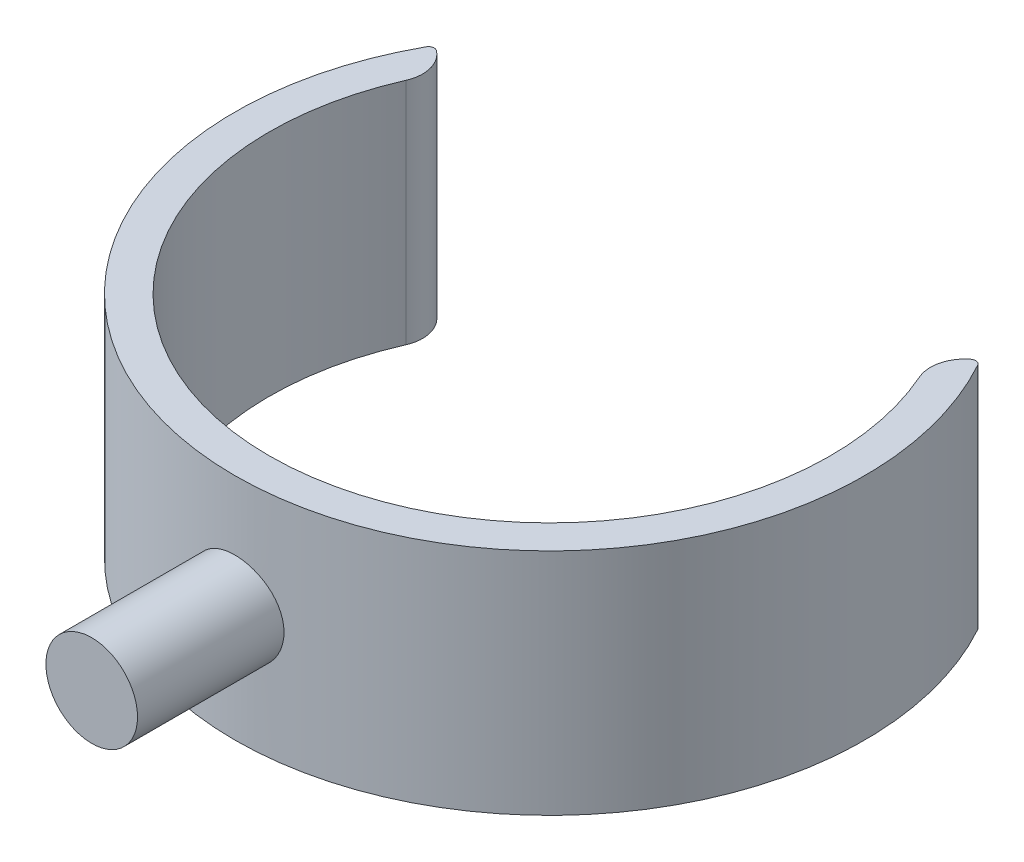
ISO-10303-21;
HEADER;
FILE_DESCRIPTION(('STEP AP214'),'2;1');
FILE_NAME('part.step','',(''),(''),'','','');
FILE_SCHEMA(('AUTOMOTIVE_DESIGN { 1 0 10303 214 1 1 1 1 }'));
ENDSEC;
DATA;
#1=APPLICATION_CONTEXT('core data for automotive mechanical design processes');
#2=APPLICATION_PROTOCOL_DEFINITION('international standard','automotive_design',2000,#1);
#3=PRODUCT_CONTEXT('',#1,'mechanical');
#4=PRODUCT('Part','Part','',(#3));
#5=PRODUCT_RELATED_PRODUCT_CATEGORY('part','',(#4));
#6=PRODUCT_DEFINITION_FORMATION('','',#4);
#7=PRODUCT_DEFINITION_CONTEXT('part definition',#1,'design');
#8=PRODUCT_DEFINITION('design','',#6,#7);
#9=PRODUCT_DEFINITION_SHAPE('','',#8);
#10=(LENGTH_UNIT() NAMED_UNIT(*) SI_UNIT(.MILLI.,.METRE.));
#11=(NAMED_UNIT(*) PLANE_ANGLE_UNIT() SI_UNIT($,.RADIAN.));
#12=(NAMED_UNIT(*) SI_UNIT($,.STERADIAN.) SOLID_ANGLE_UNIT());
#13=UNCERTAINTY_MEASURE_WITH_UNIT(LENGTH_MEASURE(1.E-05),#10,'distance_accuracy_value','');
#14=(GEOMETRIC_REPRESENTATION_CONTEXT(3) GLOBAL_UNCERTAINTY_ASSIGNED_CONTEXT((#13)) GLOBAL_UNIT_ASSIGNED_CONTEXT((#10,
#11,#12)) REPRESENTATION_CONTEXT('',''));
#15=CARTESIAN_POINT('',(0.,0.,0.));
#16=DIRECTION('',(0.,0.,1.));
#17=DIRECTION('',(1.,0.,0.));
#18=AXIS2_PLACEMENT_3D('',#15,#16,#17);
#19=CARTESIAN_POINT('',(0.,20.,0.));
#20=DIRECTION('',(0.,-1.,0.));
#21=DIRECTION('',(0.,0.,-1.));
#22=AXIS2_PLACEMENT_3D('',#19,#20,#21);
#23=CYLINDRICAL_SURFACE('',#22,24.5);
#24=CARTESIAN_POINT('',(0.,0.,0.));
#25=DIRECTION('',(0.,1.,0.));
#26=DIRECTION('',(0.,0.,1.));
#27=AXIS2_PLACEMENT_3D('',#24,#25,#26);
#28=CIRCLE('',#27,24.5);
#29=CARTESIAN_POINT('',(-22.4273545257035,0.,-9.86223955186692));
#30=VERTEX_POINT('',#29);
#31=CARTESIAN_POINT('',(22.4273545257035,0.,-9.86223955186692));
#32=VERTEX_POINT('',#31);
#33=EDGE_CURVE('E95',#30,#32,#28,.T.);
#34=ORIENTED_EDGE('',*,*,#33,.F.);
#35=DIRECTION('',(0.,-1.,0.));
#36=VECTOR('',#35,1.);
#37=CARTESIAN_POINT('',(-22.4273545257035,20.,-9.86223955186692));
#38=LINE('',#37,#36);
#39=CARTESIAN_POINT('',(-22.4273545257035,20.,-9.86223955186692));
#40=VERTEX_POINT('',#39);
#41=EDGE_CURVE('E105',#30,#40,#38,.F.);
#42=ORIENTED_EDGE('',*,*,#41,.T.);
#43=CARTESIAN_POINT('',(0.,20.,0.));
#44=DIRECTION('',(0.,1.,0.));
#45=DIRECTION('',(0.,0.,1.));
#46=AXIS2_PLACEMENT_3D('',#43,#44,#45);
#47=CIRCLE('',#46,24.5);
#48=CARTESIAN_POINT('',(22.4273545257035,20.,-9.86223955186692));
#49=VERTEX_POINT('',#48);
#50=EDGE_CURVE('E142',#40,#49,#47,.T.);
#51=ORIENTED_EDGE('',*,*,#50,.T.);
#52=DIRECTION('',(0.,-1.,0.));
#53=VECTOR('',#52,1.);
#54=CARTESIAN_POINT('',(22.4273545257035,20.,-9.86223955186692));
#55=LINE('',#54,#53);
#56=EDGE_CURVE('E99',#49,#32,#55,.T.);
#57=ORIENTED_EDGE('',*,*,#56,.T.);
#58=EDGE_LOOP('',(#34,#42,#51,#57));
#59=FACE_BOUND('',#58,.T.);
#60=ADVANCED_FACE('F37',(#59),#23,.F.);
#61=CARTESIAN_POINT('',(0.,20.,0.));
#62=DIRECTION('',(0.,-1.,0.));
#63=DIRECTION('',(0.,0.,-1.));
#64=AXIS2_PLACEMENT_3D('',#61,#62,#63);
#65=CYLINDRICAL_SURFACE('',#64,27.5);
#66=CARTESIAN_POINT('',(4.,10.,27.2075357208256));
#67=CARTESIAN_POINT('',(3.99999071530381,10.2234029490372,27.2075393657287));
#68=CARTESIAN_POINT('',(3.98122090805807,10.4469375263523,27.2103170470736));
#69=CARTESIAN_POINT('',(3.90665434013802,10.8877625205489,27.2211207803406));
#70=CARTESIAN_POINT('',(3.85082096135135,11.1050465402724,27.2291520225674));
#71=CARTESIAN_POINT('',(3.7038281632517,11.5269254685384,27.2495344213579));
#72=CARTESIAN_POINT('',(3.61269524194203,11.731529761939,27.2618823368855));
#73=CARTESIAN_POINT('',(3.39775165600477,12.1225115311333,27.2895029279586));
#74=CARTESIAN_POINT('',(3.27394570107951,12.308891628578,27.3047751818841));
#75=CARTESIAN_POINT('',(2.99617369062239,12.6595694032203,27.3366523520178));
#76=CARTESIAN_POINT('',(2.84201006369098,12.8237098501583,27.3532655532868));
#77=CARTESIAN_POINT('',(2.5083252915782,13.1238872769591,27.3858786820259));
#78=CARTESIAN_POINT('',(2.32880277969832,13.2599227411508,27.4018785763833));
#79=CARTESIAN_POINT('',(1.94849227479999,13.5006059360737,27.4315487033821));
#80=CARTESIAN_POINT('',(1.74761201220045,13.6051093182972,27.4452081020762));
#81=CARTESIAN_POINT('',(1.33091895764602,13.7788359055213,27.4685665549574));
#82=CARTESIAN_POINT('',(1.11510690923922,13.8480608658238,27.4782658061796));
#83=CARTESIAN_POINT('',(0.676293896302678,13.9487901461409,27.4925526877798));
#84=CARTESIAN_POINT('',(0.45335448032573,13.9805574596861,27.4971759411997));
#85=CARTESIAN_POINT('',(0.00526470990794896,14.0062859993333,27.5009119204721));
#86=CARTESIAN_POINT('',(-0.219885528000647,14.0002492075193,27.5000249352286));
#87=CARTESIAN_POINT('',(-0.664212426698917,13.950749069289,27.4928689083587));
#88=CARTESIAN_POINT('',(-0.88342135422898,13.9075686427137,27.4866405525721));
#89=CARTESIAN_POINT('',(-1.31144841641488,13.7854507053777,27.4695469670995));
#90=CARTESIAN_POINT('',(-1.52026629660067,13.7065123194054,27.458681623919));
#91=CARTESIAN_POINT('',(-1.92244382711024,13.5148274214503,27.4334648803034));
#92=CARTESIAN_POINT('',(-2.11574559855777,13.4019611584762,27.4191011667606));
#93=CARTESIAN_POINT('',(-2.48077262259498,13.1457117291551,27.3884897332837));
#94=CARTESIAN_POINT('',(-2.65249653748423,13.002326672305,27.372241896665));
#95=CARTESIAN_POINT('',(-2.97115990300804,12.6875320627452,27.339498081375));
#96=CARTESIAN_POINT('',(-3.11785543245604,12.5158755774535,27.3230011975424));
#97=CARTESIAN_POINT('',(-3.38039490778347,12.1502515656472,27.2917655103311));
#98=CARTESIAN_POINT('',(-3.49623868452866,11.9562839168276,27.2770267165908));
#99=CARTESIAN_POINT('',(-3.69381549310607,11.5512965799512,27.2509763735489));
#100=CARTESIAN_POINT('',(-3.7755245356015,11.3402650235575,27.2396672360788));
#101=CARTESIAN_POINT('',(-3.9022727622205,10.9072733308602,27.2218001399068));
#102=CARTESIAN_POINT('',(-3.94731436911384,10.6853139176333,27.2152418672988));
#103=CARTESIAN_POINT('',(-3.99911687867137,10.238934220196,27.2076782149972));
#104=CARTESIAN_POINT('',(-4.00622306651308,10.0145548250859,27.2066227512425));
#105=CARTESIAN_POINT('',(-3.9828682156858,9.56780838913431,27.2100513533079));
#106=CARTESIAN_POINT('',(-3.95240827080965,9.34544128989179,27.2145352578411));
#107=CARTESIAN_POINT('',(-3.85507824190906,8.91009449495342,27.228491427929));
#108=CARTESIAN_POINT('',(-3.78837923708166,8.69707573407349,27.2379402480185));
#109=CARTESIAN_POINT('',(-3.6206420244832,8.285242383051,27.2607423416073));
#110=CARTESIAN_POINT('',(-3.51960221441636,8.08642845621082,27.2740957972876));
#111=CARTESIAN_POINT('',(-3.28521818764151,7.70709774918603,27.3033209540723));
#112=CARTESIAN_POINT('',(-3.15164988778391,7.5267207745806,27.319209847637));
#113=CARTESIAN_POINT('',(-2.85631292295714,7.19081929984677,27.3516634112332));
#114=CARTESIAN_POINT('',(-2.69454276143423,7.03529611944417,27.3682281170915));
#115=CARTESIAN_POINT('',(-2.34587587886223,6.75228221862923,27.4003229031752));
#116=CARTESIAN_POINT('',(-2.1587927624122,6.62501995081778,27.4158438912002));
#117=CARTESIAN_POINT('',(-1.76570355429491,6.40372989871579,27.4439622393275));
#118=CARTESIAN_POINT('',(-1.55969795502585,6.30970124993316,27.456559675476));
#119=CARTESIAN_POINT('',(-1.13533367460911,6.15791498640842,27.4773715996857));
#120=CARTESIAN_POINT('',(-0.917020943562964,6.10003108259589,27.485601333116));
#121=CARTESIAN_POINT('',(-0.473645956272785,6.02176826150813,27.4968144521197));
#122=CARTESIAN_POINT('',(-0.248584118943929,6.0013870213296,27.4997981626295));
#123=CARTESIAN_POINT('',(0.199681815480478,5.99876217987708,27.5001801347239));
#124=CARTESIAN_POINT('',(0.42288389841543,6.01616851125852,27.4976296655349));
#125=CARTESIAN_POINT('',(0.863152057968898,6.08787609886634,27.4873329289863));
#126=CARTESIAN_POINT('',(1.0802181508697,6.14217725718013,27.4795866754154));
#127=CARTESIAN_POINT('',(1.50196616931985,6.28601158883878,27.4597646504214));
#128=CARTESIAN_POINT('',(1.70665601278518,6.37552195534809,27.4476916820858));
#129=CARTESIAN_POINT('',(2.09816627615072,6.58719679761258,27.420544369129));
#130=CARTESIAN_POINT('',(2.28498618577768,6.70936220544974,27.4054699388396));
#131=CARTESIAN_POINT('',(2.63723178783112,6.98415112814761,27.3738306548321));
#132=CARTESIAN_POINT('',(2.80245442655954,7.13703357766175,27.3572538370088));
#133=CARTESIAN_POINT('',(3.10502859500889,7.46837242925572,27.3245680454257));
#134=CARTESIAN_POINT('',(3.24237356609615,7.64683483258772,27.3084591825212));
#135=CARTESIAN_POINT('',(3.48593793197216,8.02536827587219,27.278442408471));
#136=CARTESIAN_POINT('',(3.59198969019887,8.22554810991164,27.2645465284694));
#137=CARTESIAN_POINT('',(3.76880993218578,8.64098271250318,27.2406699994921));
#138=CARTESIAN_POINT('',(3.83961537702658,8.85622141816735,27.2306852514564));
#139=CARTESIAN_POINT('',(3.92769031264251,9.22704747018507,27.2180914767198));
#140=CARTESIAN_POINT('',(3.9547654519801,9.38033419447199,27.2141538031387));
#141=CARTESIAN_POINT('',(3.99092342091043,9.68905937139982,27.2088746719642));
#142=CARTESIAN_POINT('',(4.00000646271995,9.84449779863962,27.2075331837487));
#143=CARTESIAN_POINT('',(4.,10.,27.2075357208256));
#144=B_SPLINE_CURVE_WITH_KNOTS('',3,(#66,#67,#68,#69,#70,#71,#72,#73,#74,#75,#76,#77,#78,#79,
#80,#81,#82,#83,#84,#85,#86,#87,#88,#89,#90,#91,#92,#93,#94,#95,#96,#97,#98,#99,#100,#101,#102,
#103,#104,#105,#106,#107,#108,#109,#110,#111,#112,#113,#114,#115,#116,#117,#118,#119,#120,#121,
#122,#123,#124,#125,#126,#127,#128,#129,#130,#131,#132,#133,#134,#135,#136,#137,#138,#139,#140,
#141,#142,#143),.UNSPECIFIED.,.T.,.F.,(4,2,2,2,2,2,2,2,2,2,2,2,2,2,2,2,2,2,2,2,2,2,2,2,2,2,2,2,
2,2,2,2,2,2,2,2,2,2,4),(0.,0.669640530922852,1.3399436407313,2.00974455198318,2.67944896648646,
3.35366522672418,4.02791783722641,4.70521179948524,5.38247205923251,6.05494835047509,
6.72738938381733,7.39475339341229,8.06213373828702,8.73189787651078,9.40170351571489,
10.0777041807105,10.7537085515736,11.4301872113424,12.1066211697275,12.7768876491905,
13.4471346133264,14.1142445915296,14.7813857004611,15.4532595192413,16.1251690023872,
16.8023268216571,17.4794670250105,18.1542278767067,18.8289469325189,19.4974420251979,
20.1659353438114,20.8339963557195,21.5020764383163,22.1760442119613,22.8501703631771,
23.5278448193372,24.2048071265458,24.6709236454603,25.1370346664983),.UNSPECIFIED.);
#145=CARTESIAN_POINT('',(4.,10.,27.2075357208256));
#146=VERTEX_POINT('',#145);
#147=EDGE_CURVE('E109',#146,#146,#144,.T.);
#148=ORIENTED_EDGE('',*,*,#147,.F.);
#149=EDGE_LOOP('',(#148));
#150=FACE_BOUND('',#149,.T.);
#151=CARTESIAN_POINT('',(0.,0.,0.));
#152=DIRECTION('',(0.,1.,0.));
#153=DIRECTION('',(0.,0.,1.));
#154=AXIS2_PLACEMENT_3D('',#151,#152,#153);
#155=CIRCLE('',#154,27.5);
#156=CARTESIAN_POINT('',(-24.0777490333652,0.,-13.285781929803));
#157=VERTEX_POINT('',#156);
#158=CARTESIAN_POINT('',(24.0777490333652,0.,-13.285781929803));
#159=VERTEX_POINT('',#158);
#160=EDGE_CURVE('E108',#157,#159,#155,.T.);
#161=ORIENTED_EDGE('',*,*,#160,.T.);
#162=DIRECTION('',(0.,-1.,0.));
#163=VECTOR('',#162,1.);
#164=CARTESIAN_POINT('',(24.0777490333652,20.,-13.285781929803));
#165=LINE('',#164,#163);
#166=CARTESIAN_POINT('',(24.0777490333652,20.,-13.285781929803));
#167=VERTEX_POINT('',#166);
#168=EDGE_CURVE('E58',#159,#167,#165,.F.);
#169=ORIENTED_EDGE('',*,*,#168,.T.);
#170=CARTESIAN_POINT('',(0.,20.,0.));
#171=DIRECTION('',(0.,1.,0.));
#172=DIRECTION('',(0.,0.,1.));
#173=AXIS2_PLACEMENT_3D('',#170,#171,#172);
#174=CIRCLE('',#173,27.5);
#175=CARTESIAN_POINT('',(-24.0777490333652,20.,-13.285781929803));
#176=VERTEX_POINT('',#175);
#177=EDGE_CURVE('E134',#176,#167,#174,.T.);
#178=ORIENTED_EDGE('',*,*,#177,.F.);
#179=DIRECTION('',(0.,-1.,0.));
#180=VECTOR('',#179,1.);
#181=CARTESIAN_POINT('',(-24.0777490333652,20.,-13.285781929803));
#182=LINE('',#181,#180);
#183=EDGE_CURVE('E125',#176,#157,#182,.T.);
#184=ORIENTED_EDGE('',*,*,#183,.T.);
#185=EDGE_LOOP('',(#161,#169,#178,#184));
#186=FACE_BOUND('',#185,.T.);
#187=ADVANCED_FACE('F140',(#150,#186),#65,.T.);
#188=CARTESIAN_POINT('',(-53.6163716834699,20.,6.87500000000003));
#189=DIRECTION('',(0.,1.,0.));
#190=DIRECTION('',(0.,0.,1.));
#191=AXIS2_PLACEMENT_3D('',#188,#189,#190);
#192=PLANE('',#191);
#193=ORIENTED_EDGE('',*,*,#177,.T.);
#194=CARTESIAN_POINT('',(23.6399717782131,20.,-13.0442222583521));
#195=DIRECTION('',(0.,1.,0.));
#196=DIRECTION('',(0.,0.,1.));
#197=AXIS2_PLACEMENT_3D('',#194,#195,#196);
#198=CIRCLE('',#197,0.5);
#199=CARTESIAN_POINT('',(23.3332538933917,20.,-13.4390945657258));
#200=VERTEX_POINT('',#199);
#201=EDGE_CURVE('E45',#167,#200,#198,.T.);
#202=ORIENTED_EDGE('',*,*,#201,.T.);
#203=CARTESIAN_POINT('',(25.1735612023202,20.,-11.0698607214833));
#204=DIRECTION('',(0.,1.,0.));
#205=DIRECTION('',(0.,0.,1.));
#206=AXIS2_PLACEMENT_3D('',#203,#204,#205);
#207=CIRCLE('',#206,3.);
#208=EDGE_CURVE('E113',#200,#49,#207,.T.);
#209=ORIENTED_EDGE('',*,*,#208,.T.);
#210=ORIENTED_EDGE('',*,*,#50,.F.);
#211=CARTESIAN_POINT('',(-25.1735612023202,20.,-11.0698607214833));
#212=DIRECTION('',(0.,1.,0.));
#213=DIRECTION('',(0.,0.,1.));
#214=AXIS2_PLACEMENT_3D('',#211,#212,#213);
#215=CIRCLE('',#214,3.);
#216=CARTESIAN_POINT('',(-23.3332538933917,20.,-13.4390945657258));
#217=VERTEX_POINT('',#216);
#218=EDGE_CURVE('E112',#40,#217,#215,.T.);
#219=ORIENTED_EDGE('',*,*,#218,.T.);
#220=CARTESIAN_POINT('',(-23.6399717782131,20.,-13.0442222583521));
#221=DIRECTION('',(0.,1.,0.));
#222=DIRECTION('',(0.,0.,1.));
#223=AXIS2_PLACEMENT_3D('',#220,#221,#222);
#224=CIRCLE('',#223,0.5);
#225=EDGE_CURVE('E129',#217,#176,#224,.T.);
#226=ORIENTED_EDGE('',*,*,#225,.T.);
#227=EDGE_LOOP('',(#193,#202,#209,#210,#219,#226));
#228=FACE_BOUND('',#227,.T.);
#229=ADVANCED_FACE('F133',(#228),#192,.T.);
#230=CARTESIAN_POINT('',(-53.6163716834699,0.,6.87500000000003));
#231=DIRECTION('',(0.,1.,0.));
#232=DIRECTION('',(0.,0.,1.));
#233=AXIS2_PLACEMENT_3D('',#230,#231,#232);
#234=PLANE('',#233);
#235=CARTESIAN_POINT('',(25.1735612023202,0.,-11.0698607214833));
#236=DIRECTION('',(0.,1.,0.));
#237=DIRECTION('',(0.,0.,1.));
#238=AXIS2_PLACEMENT_3D('',#235,#236,#237);
#239=CIRCLE('',#238,3.);
#240=CARTESIAN_POINT('',(23.3332538933917,0.,-13.4390945657258));
#241=VERTEX_POINT('',#240);
#242=EDGE_CURVE('E100',#32,#241,#239,.F.);
#243=ORIENTED_EDGE('',*,*,#242,.T.);
#244=CARTESIAN_POINT('',(23.6399717782131,0.,-13.0442222583521));
#245=DIRECTION('',(0.,1.,0.));
#246=DIRECTION('',(0.,0.,1.));
#247=AXIS2_PLACEMENT_3D('',#244,#245,#246);
#248=CIRCLE('',#247,0.5);
#249=EDGE_CURVE('E123',#241,#159,#248,.F.);
#250=ORIENTED_EDGE('',*,*,#249,.T.);
#251=ORIENTED_EDGE('',*,*,#160,.F.);
#252=CARTESIAN_POINT('',(-23.6399717782131,0.,-13.0442222583521));
#253=DIRECTION('',(0.,1.,0.));
#254=DIRECTION('',(0.,0.,1.));
#255=AXIS2_PLACEMENT_3D('',#252,#253,#254);
#256=CIRCLE('',#255,0.5);
#257=CARTESIAN_POINT('',(-23.3332538933917,0.,-13.4390945657258));
#258=VERTEX_POINT('',#257);
#259=EDGE_CURVE('E97',#157,#258,#256,.F.);
#260=ORIENTED_EDGE('',*,*,#259,.T.);
#261=CARTESIAN_POINT('',(-25.1735612023202,0.,-11.0698607214833));
#262=DIRECTION('',(0.,1.,0.));
#263=DIRECTION('',(0.,0.,1.));
#264=AXIS2_PLACEMENT_3D('',#261,#262,#263);
#265=CIRCLE('',#264,3.);
#266=EDGE_CURVE('E91',#258,#30,#265,.F.);
#267=ORIENTED_EDGE('',*,*,#266,.T.);
#268=ORIENTED_EDGE('',*,*,#33,.T.);
#269=EDGE_LOOP('',(#243,#250,#251,#260,#267,#268));
#270=FACE_BOUND('',#269,.T.);
#271=ADVANCED_FACE('F94',(#270),#234,.F.);
#272=CARTESIAN_POINT('',(0.,10.,40.));
#273=DIRECTION('',(0.,0.,1.));
#274=DIRECTION('',(1.,0.,0.));
#275=AXIS2_PLACEMENT_3D('',#272,#273,#274);
#276=PLANE('',#275);
#277=CARTESIAN_POINT('',(0.,10.,40.));
#278=DIRECTION('',(0.,0.,1.));
#279=DIRECTION('',(1.,0.,0.));
#280=AXIS2_PLACEMENT_3D('',#277,#278,#279);
#281=CIRCLE('',#280,4.);
#282=CARTESIAN_POINT('',(4.,10.,40.));
#283=VERTEX_POINT('',#282);
#284=EDGE_CURVE('E154',#283,#283,#281,.T.);
#285=ORIENTED_EDGE('',*,*,#284,.T.);
#286=EDGE_LOOP('',(#285));
#287=FACE_BOUND('',#286,.T.);
#288=ADVANCED_FACE('F160',(#287),#276,.T.);
#289=CARTESIAN_POINT('',(0.,10.,-13.7509999999999));
#290=DIRECTION('',(0.,0.,1.));
#291=DIRECTION('',(1.,0.,0.));
#292=AXIS2_PLACEMENT_3D('',#289,#290,#291);
#293=CYLINDRICAL_SURFACE('',#292,4.);
#294=ORIENTED_EDGE('',*,*,#284,.F.);
#295=EDGE_LOOP('',(#294));
#296=FACE_BOUND('',#295,.T.);
#297=ORIENTED_EDGE('',*,*,#147,.T.);
#298=EDGE_LOOP('',(#297));
#299=FACE_BOUND('',#298,.T.);
#300=ADVANCED_FACE('F155',(#296,#299),#293,.T.);
#301=CARTESIAN_POINT('',(-25.1735612023202,20.,-11.0698607214833));
#302=DIRECTION('',(0.,-1.,0.));
#303=DIRECTION('',(0.,0.,-1.));
#304=AXIS2_PLACEMENT_3D('',#301,#302,#303);
#305=CYLINDRICAL_SURFACE('',#304,3.);
#306=ORIENTED_EDGE('',*,*,#266,.F.);
#307=DIRECTION('',(0.,-1.,0.));
#308=VECTOR('',#307,1.);
#309=CARTESIAN_POINT('',(-23.3332538933917,20.,-13.4390945657258));
#310=LINE('',#309,#308);
#311=EDGE_CURVE('E11',#258,#217,#310,.F.);
#312=ORIENTED_EDGE('',*,*,#311,.T.);
#313=ORIENTED_EDGE('',*,*,#218,.F.);
#314=ORIENTED_EDGE('',*,*,#41,.F.);
#315=EDGE_LOOP('',(#306,#312,#313,#314));
#316=FACE_BOUND('',#315,.T.);
#317=ADVANCED_FACE('F111',(#316),#305,.T.);
#318=CARTESIAN_POINT('',(25.1735612023202,20.,-11.0698607214833));
#319=DIRECTION('',(0.,-1.,0.));
#320=DIRECTION('',(0.,0.,-1.));
#321=AXIS2_PLACEMENT_3D('',#318,#319,#320);
#322=CYLINDRICAL_SURFACE('',#321,3.);
#323=ORIENTED_EDGE('',*,*,#208,.F.);
#324=DIRECTION('',(0.,-1.,0.));
#325=VECTOR('',#324,1.);
#326=CARTESIAN_POINT('',(23.3332538933917,20.,-13.4390945657258));
#327=LINE('',#326,#325);
#328=EDGE_CURVE('E119',#200,#241,#327,.T.);
#329=ORIENTED_EDGE('',*,*,#328,.T.);
#330=ORIENTED_EDGE('',*,*,#242,.F.);
#331=ORIENTED_EDGE('',*,*,#56,.F.);
#332=EDGE_LOOP('',(#323,#329,#330,#331));
#333=FACE_BOUND('',#332,.T.);
#334=ADVANCED_FACE('F138',(#333),#322,.T.);
#335=CARTESIAN_POINT('',(23.6399717782131,20.,-13.0442222583521));
#336=DIRECTION('',(0.,-1.,0.));
#337=DIRECTION('',(0.,0.,-1.));
#338=AXIS2_PLACEMENT_3D('',#335,#336,#337);
#339=CYLINDRICAL_SURFACE('',#338,0.5);
#340=ORIENTED_EDGE('',*,*,#201,.F.);
#341=ORIENTED_EDGE('',*,*,#168,.F.);
#342=ORIENTED_EDGE('',*,*,#249,.F.);
#343=ORIENTED_EDGE('',*,*,#328,.F.);
#344=EDGE_LOOP('',(#340,#341,#342,#343));
#345=FACE_BOUND('',#344,.T.);
#346=ADVANCED_FACE('F139',(#345),#339,.T.);
#347=CARTESIAN_POINT('',(-23.6399717782131,20.,-13.0442222583521));
#348=DIRECTION('',(0.,-1.,0.));
#349=DIRECTION('',(0.,0.,-1.));
#350=AXIS2_PLACEMENT_3D('',#347,#348,#349);
#351=CYLINDRICAL_SURFACE('',#350,0.5);
#352=ORIENTED_EDGE('',*,*,#225,.F.);
#353=ORIENTED_EDGE('',*,*,#311,.F.);
#354=ORIENTED_EDGE('',*,*,#259,.F.);
#355=ORIENTED_EDGE('',*,*,#183,.F.);
#356=EDGE_LOOP('',(#352,#353,#354,#355));
#357=FACE_BOUND('',#356,.T.);
#358=ADVANCED_FACE('F39',(#357),#351,.T.);
#359=CLOSED_SHELL('',(#60,#187,#229,#271,#288,#300,#317,#334,#346,#358));
#360=MANIFOLD_SOLID_BREP('B2',#359);
#361=ADVANCED_BREP_SHAPE_REPRESENTATION('',(#18,#360),#14);
#362=SHAPE_DEFINITION_REPRESENTATION(#9,#361);
ENDSEC;
END-ISO-10303-21;
